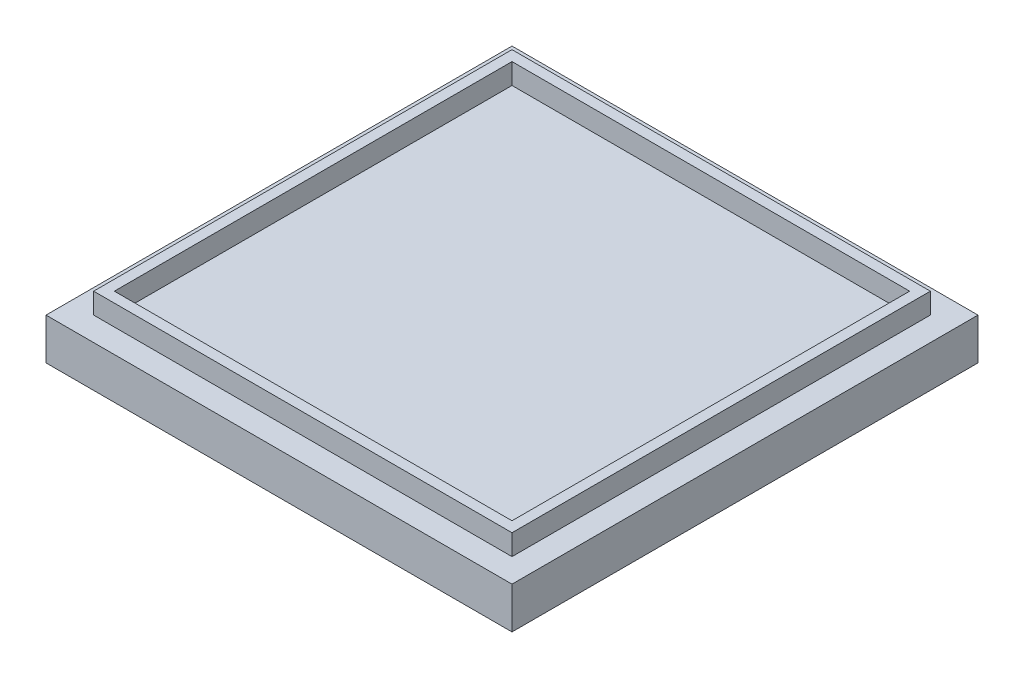
ISO-10303-21;
HEADER;
FILE_DESCRIPTION(('STEP AP214'),'2;1');
FILE_NAME('part.step','',(''),(''),'','','');
FILE_SCHEMA(('AUTOMOTIVE_DESIGN { 1 0 10303 214 1 1 1 1 }'));
ENDSEC;
DATA;
#1=APPLICATION_CONTEXT('core data for automotive mechanical design processes');
#2=APPLICATION_PROTOCOL_DEFINITION('international standard','automotive_design',2000,#1);
#3=PRODUCT_CONTEXT('',#1,'mechanical');
#4=PRODUCT('Part','Part','',(#3));
#5=PRODUCT_RELATED_PRODUCT_CATEGORY('part','',(#4));
#6=PRODUCT_DEFINITION_FORMATION('','',#4);
#7=PRODUCT_DEFINITION_CONTEXT('part definition',#1,'design');
#8=PRODUCT_DEFINITION('design','',#6,#7);
#9=PRODUCT_DEFINITION_SHAPE('','',#8);
#10=(LENGTH_UNIT() NAMED_UNIT(*) SI_UNIT(.MILLI.,.METRE.));
#11=(NAMED_UNIT(*) PLANE_ANGLE_UNIT() SI_UNIT($,.RADIAN.));
#12=(NAMED_UNIT(*) SI_UNIT($,.STERADIAN.) SOLID_ANGLE_UNIT());
#13=UNCERTAINTY_MEASURE_WITH_UNIT(LENGTH_MEASURE(1.E-05),#10,'distance_accuracy_value','');
#14=(GEOMETRIC_REPRESENTATION_CONTEXT(3) GLOBAL_UNCERTAINTY_ASSIGNED_CONTEXT((#13)) GLOBAL_UNIT_ASSIGNED_CONTEXT((#10,
#11,#12)) REPRESENTATION_CONTEXT('',''));
#15=CARTESIAN_POINT('',(0.,0.,0.));
#16=DIRECTION('',(0.,0.,1.));
#17=DIRECTION('',(1.,0.,0.));
#18=AXIS2_PLACEMENT_3D('',#15,#16,#17);
#19=CARTESIAN_POINT('',(0.,20.,0.));
#20=DIRECTION('',(0.,-1.,0.));
#21=DIRECTION('',(0.,0.,-1.));
#22=AXIS2_PLACEMENT_3D('',#19,#20,#21);
#23=PLANE('',#22);
#24=DIRECTION('',(0.,0.,-1.));
#25=VECTOR('',#24,1.);
#26=CARTESIAN_POINT('',(112.5,20.,112.5));
#27=LINE('',#26,#25);
#28=CARTESIAN_POINT('',(112.5,20.,112.5));
#29=VERTEX_POINT('',#28);
#30=CARTESIAN_POINT('',(112.5,20.,-112.5));
#31=VERTEX_POINT('',#30);
#32=EDGE_CURVE('E197',#29,#31,#27,.T.);
#33=ORIENTED_EDGE('',*,*,#32,.T.);
#34=DIRECTION('',(-1.,0.,0.));
#35=VECTOR('',#34,1.);
#36=CARTESIAN_POINT('',(-112.5,20.,-112.5));
#37=LINE('',#36,#35);
#38=CARTESIAN_POINT('',(-112.5,20.,-112.5));
#39=VERTEX_POINT('',#38);
#40=EDGE_CURVE('E200',#31,#39,#37,.T.);
#41=ORIENTED_EDGE('',*,*,#40,.T.);
#42=DIRECTION('',(0.,0.,1.));
#43=VECTOR('',#42,1.);
#44=CARTESIAN_POINT('',(-112.5,20.,112.5));
#45=LINE('',#44,#43);
#46=CARTESIAN_POINT('',(-112.5,20.,112.5));
#47=VERTEX_POINT('',#46);
#48=EDGE_CURVE('E203',#39,#47,#45,.T.);
#49=ORIENTED_EDGE('',*,*,#48,.T.);
#50=DIRECTION('',(1.,0.,0.));
#51=VECTOR('',#50,1.);
#52=CARTESIAN_POINT('',(-112.5,20.,112.5));
#53=LINE('',#52,#51);
#54=EDGE_CURVE('E205',#47,#29,#53,.T.);
#55=ORIENTED_EDGE('',*,*,#54,.T.);
#56=EDGE_LOOP('',(#33,#41,#49,#55));
#57=FACE_BOUND('',#56,.T.);
#58=DIRECTION('',(0.,0.,-1.));
#59=VECTOR('',#58,1.);
#60=CARTESIAN_POINT('',(101.,20.,101.));
#61=LINE('',#60,#59);
#62=CARTESIAN_POINT('',(101.,20.,101.));
#63=VERTEX_POINT('',#62);
#64=CARTESIAN_POINT('',(101.,20.,-101.));
#65=VERTEX_POINT('',#64);
#66=EDGE_CURVE('E145',#63,#65,#61,.T.);
#67=ORIENTED_EDGE('',*,*,#66,.F.);
#68=DIRECTION('',(1.,0.,0.));
#69=VECTOR('',#68,1.);
#70=CARTESIAN_POINT('',(-101.,20.,101.));
#71=LINE('',#70,#69);
#72=CARTESIAN_POINT('',(-101.,20.,101.));
#73=VERTEX_POINT('',#72);
#74=EDGE_CURVE('E173',#73,#63,#71,.T.);
#75=ORIENTED_EDGE('',*,*,#74,.F.);
#76=DIRECTION('',(0.,0.,1.));
#77=VECTOR('',#76,1.);
#78=CARTESIAN_POINT('',(-101.,20.,101.));
#79=LINE('',#78,#77);
#80=CARTESIAN_POINT('',(-101.,20.,-101.));
#81=VERTEX_POINT('',#80);
#82=EDGE_CURVE('E59',#81,#73,#79,.T.);
#83=ORIENTED_EDGE('',*,*,#82,.F.);
#84=DIRECTION('',(-1.,0.,0.));
#85=VECTOR('',#84,1.);
#86=CARTESIAN_POINT('',(-101.,20.,-101.));
#87=LINE('',#86,#85);
#88=EDGE_CURVE('E54',#65,#81,#87,.T.);
#89=ORIENTED_EDGE('',*,*,#88,.F.);
#90=EDGE_LOOP('',(#67,#75,#83,#89));
#91=FACE_BOUND('',#90,.T.);
#92=ADVANCED_FACE('F39',(#57,#91),#23,.F.);
#93=CARTESIAN_POINT('',(112.5,20.,112.5));
#94=DIRECTION('',(-1.,0.,0.));
#95=DIRECTION('',(0.,0.,1.));
#96=AXIS2_PLACEMENT_3D('',#93,#94,#95);
#97=PLANE('',#96);
#98=DIRECTION('',(0.,0.,-1.));
#99=VECTOR('',#98,1.);
#100=CARTESIAN_POINT('',(112.5,0.,112.5));
#101=LINE('',#100,#99);
#102=CARTESIAN_POINT('',(112.5,0.,112.5));
#103=VERTEX_POINT('',#102);
#104=CARTESIAN_POINT('',(112.5,0.,-112.5));
#105=VERTEX_POINT('',#104);
#106=EDGE_CURVE('E196',#103,#105,#101,.T.);
#107=ORIENTED_EDGE('',*,*,#106,.T.);
#108=DIRECTION('',(0.,-1.,0.));
#109=VECTOR('',#108,1.);
#110=CARTESIAN_POINT('',(112.5,20.,-112.5));
#111=LINE('',#110,#109);
#112=EDGE_CURVE('E11',#31,#105,#111,.T.);
#113=ORIENTED_EDGE('',*,*,#112,.F.);
#114=ORIENTED_EDGE('',*,*,#32,.F.);
#115=DIRECTION('',(0.,-1.,0.));
#116=VECTOR('',#115,1.);
#117=CARTESIAN_POINT('',(112.5,20.,112.5));
#118=LINE('',#117,#116);
#119=EDGE_CURVE('E207',#29,#103,#118,.T.);
#120=ORIENTED_EDGE('',*,*,#119,.T.);
#121=EDGE_LOOP('',(#107,#113,#114,#120));
#122=FACE_BOUND('',#121,.T.);
#123=ADVANCED_FACE('F41',(#122),#97,.F.);
#124=CARTESIAN_POINT('',(-112.5,20.,-112.5));
#125=DIRECTION('',(0.,0.,1.));
#126=DIRECTION('',(1.,0.,0.));
#127=AXIS2_PLACEMENT_3D('',#124,#125,#126);
#128=PLANE('',#127);
#129=DIRECTION('',(-1.,0.,0.));
#130=VECTOR('',#129,1.);
#131=CARTESIAN_POINT('',(-112.5,0.,-112.5));
#132=LINE('',#131,#130);
#133=CARTESIAN_POINT('',(-112.5,0.,-112.5));
#134=VERTEX_POINT('',#133);
#135=EDGE_CURVE('E210',#105,#134,#132,.T.);
#136=ORIENTED_EDGE('',*,*,#135,.T.);
#137=DIRECTION('',(0.,-1.,0.));
#138=VECTOR('',#137,1.);
#139=CARTESIAN_POINT('',(-112.5,20.,-112.5));
#140=LINE('',#139,#138);
#141=EDGE_CURVE('E47',#39,#134,#140,.T.);
#142=ORIENTED_EDGE('',*,*,#141,.F.);
#143=ORIENTED_EDGE('',*,*,#40,.F.);
#144=ORIENTED_EDGE('',*,*,#112,.T.);
#145=EDGE_LOOP('',(#136,#142,#143,#144));
#146=FACE_BOUND('',#145,.T.);
#147=ADVANCED_FACE('F239',(#146),#128,.F.);
#148=CARTESIAN_POINT('',(-112.5,20.,112.5));
#149=DIRECTION('',(1.,0.,0.));
#150=DIRECTION('',(0.,0.,-1.));
#151=AXIS2_PLACEMENT_3D('',#148,#149,#150);
#152=PLANE('',#151);
#153=DIRECTION('',(0.,0.,1.));
#154=VECTOR('',#153,1.);
#155=CARTESIAN_POINT('',(-112.5,0.,112.5));
#156=LINE('',#155,#154);
#157=CARTESIAN_POINT('',(-112.5,0.,112.5));
#158=VERTEX_POINT('',#157);
#159=EDGE_CURVE('E212',#134,#158,#156,.T.);
#160=ORIENTED_EDGE('',*,*,#159,.T.);
#161=DIRECTION('',(0.,-1.,0.));
#162=VECTOR('',#161,1.);
#163=CARTESIAN_POINT('',(-112.5,20.,112.5));
#164=LINE('',#163,#162);
#165=EDGE_CURVE('E217',#47,#158,#164,.T.);
#166=ORIENTED_EDGE('',*,*,#165,.F.);
#167=ORIENTED_EDGE('',*,*,#48,.F.);
#168=ORIENTED_EDGE('',*,*,#141,.T.);
#169=EDGE_LOOP('',(#160,#166,#167,#168));
#170=FACE_BOUND('',#169,.T.);
#171=ADVANCED_FACE('F224',(#170),#152,.F.);
#172=CARTESIAN_POINT('',(-112.5,20.,112.5));
#173=DIRECTION('',(0.,0.,-1.));
#174=DIRECTION('',(-1.,0.,0.));
#175=AXIS2_PLACEMENT_3D('',#172,#173,#174);
#176=PLANE('',#175);
#177=DIRECTION('',(1.,0.,0.));
#178=VECTOR('',#177,1.);
#179=CARTESIAN_POINT('',(-112.5,0.,112.5));
#180=LINE('',#179,#178);
#181=EDGE_CURVE('E201',#158,#103,#180,.T.);
#182=ORIENTED_EDGE('',*,*,#181,.T.);
#183=ORIENTED_EDGE('',*,*,#119,.F.);
#184=ORIENTED_EDGE('',*,*,#54,.F.);
#185=ORIENTED_EDGE('',*,*,#165,.T.);
#186=EDGE_LOOP('',(#182,#183,#184,#185));
#187=FACE_BOUND('',#186,.T.);
#188=ADVANCED_FACE('F233',(#187),#176,.F.);
#189=CARTESIAN_POINT('',(0.,0.,0.));
#190=DIRECTION('',(0.,-1.,0.));
#191=DIRECTION('',(0.,0.,-1.));
#192=AXIS2_PLACEMENT_3D('',#189,#190,#191);
#193=PLANE('',#192);
#194=ORIENTED_EDGE('',*,*,#106,.F.);
#195=ORIENTED_EDGE('',*,*,#181,.F.);
#196=ORIENTED_EDGE('',*,*,#159,.F.);
#197=ORIENTED_EDGE('',*,*,#135,.F.);
#198=EDGE_LOOP('',(#194,#195,#196,#197));
#199=FACE_BOUND('',#198,.T.);
#200=ADVANCED_FACE('F230',(#199),#193,.T.);
#201=CARTESIAN_POINT('',(0.,30.,0.));
#202=DIRECTION('',(0.,-1.,0.));
#203=DIRECTION('',(0.,0.,-1.));
#204=AXIS2_PLACEMENT_3D('',#201,#202,#203);
#205=PLANE('',#204);
#206=DIRECTION('',(0.,0.,-1.));
#207=VECTOR('',#206,1.);
#208=CARTESIAN_POINT('',(101.,30.,101.));
#209=LINE('',#208,#207);
#210=CARTESIAN_POINT('',(101.,30.,101.));
#211=VERTEX_POINT('',#210);
#212=CARTESIAN_POINT('',(101.,30.,-101.));
#213=VERTEX_POINT('',#212);
#214=EDGE_CURVE('E169',#211,#213,#209,.T.);
#215=ORIENTED_EDGE('',*,*,#214,.T.);
#216=DIRECTION('',(-1.,0.,0.));
#217=VECTOR('',#216,1.);
#218=CARTESIAN_POINT('',(-101.,30.,-101.));
#219=LINE('',#218,#217);
#220=CARTESIAN_POINT('',(-101.,30.,-101.));
#221=VERTEX_POINT('',#220);
#222=EDGE_CURVE('E172',#213,#221,#219,.T.);
#223=ORIENTED_EDGE('',*,*,#222,.T.);
#224=DIRECTION('',(0.,0.,1.));
#225=VECTOR('',#224,1.);
#226=CARTESIAN_POINT('',(-101.,30.,101.));
#227=LINE('',#226,#225);
#228=CARTESIAN_POINT('',(-101.,30.,101.));
#229=VERTEX_POINT('',#228);
#230=EDGE_CURVE('E175',#221,#229,#227,.T.);
#231=ORIENTED_EDGE('',*,*,#230,.T.);
#232=DIRECTION('',(1.,0.,0.));
#233=VECTOR('',#232,1.);
#234=CARTESIAN_POINT('',(-101.,30.,101.));
#235=LINE('',#234,#233);
#236=EDGE_CURVE('E177',#229,#211,#235,.T.);
#237=ORIENTED_EDGE('',*,*,#236,.T.);
#238=EDGE_LOOP('',(#215,#223,#231,#237));
#239=FACE_BOUND('',#238,.T.);
#240=DIRECTION('',(0.,0.,1.));
#241=VECTOR('',#240,1.);
#242=CARTESIAN_POINT('',(-96.,30.,96.0000000000002));
#243=LINE('',#242,#241);
#244=CARTESIAN_POINT('',(-96.,30.,-96.0000000000002));
#245=VERTEX_POINT('',#244);
#246=CARTESIAN_POINT('',(-96.,30.,96.0000000000002));
#247=VERTEX_POINT('',#246);
#248=EDGE_CURVE('E127',#245,#247,#243,.T.);
#249=ORIENTED_EDGE('',*,*,#248,.F.);
#250=DIRECTION('',(-1.,0.,0.));
#251=VECTOR('',#250,1.);
#252=CARTESIAN_POINT('',(96.,30.,-96.0000000000002));
#253=LINE('',#252,#251);
#254=CARTESIAN_POINT('',(96.,30.,-96.0000000000002));
#255=VERTEX_POINT('',#254);
#256=EDGE_CURVE('E153',#255,#245,#253,.T.);
#257=ORIENTED_EDGE('',*,*,#256,.F.);
#258=DIRECTION('',(0.,0.,-1.));
#259=VECTOR('',#258,1.);
#260=CARTESIAN_POINT('',(96.,30.,96.0000000000002));
#261=LINE('',#260,#259);
#262=CARTESIAN_POINT('',(96.,30.,96.0000000000002));
#263=VERTEX_POINT('',#262);
#264=EDGE_CURVE('E151',#263,#255,#261,.T.);
#265=ORIENTED_EDGE('',*,*,#264,.F.);
#266=DIRECTION('',(1.,0.,0.));
#267=VECTOR('',#266,1.);
#268=CARTESIAN_POINT('',(96.,30.,96.0000000000002));
#269=LINE('',#268,#267);
#270=EDGE_CURVE('E137',#247,#263,#269,.T.);
#271=ORIENTED_EDGE('',*,*,#270,.F.);
#272=EDGE_LOOP('',(#249,#257,#265,#271));
#273=FACE_BOUND('',#272,.T.);
#274=ADVANCED_FACE('F149',(#239,#273),#205,.F.);
#275=CARTESIAN_POINT('',(101.,30.,101.));
#276=DIRECTION('',(-1.,0.,0.));
#277=DIRECTION('',(0.,0.,1.));
#278=AXIS2_PLACEMENT_3D('',#275,#276,#277);
#279=PLANE('',#278);
#280=ORIENTED_EDGE('',*,*,#66,.T.);
#281=DIRECTION('',(0.,-1.,0.));
#282=VECTOR('',#281,1.);
#283=CARTESIAN_POINT('',(101.,30.,-101.));
#284=LINE('',#283,#282);
#285=EDGE_CURVE('E194',#213,#65,#284,.T.);
#286=ORIENTED_EDGE('',*,*,#285,.F.);
#287=ORIENTED_EDGE('',*,*,#214,.F.);
#288=DIRECTION('',(0.,-1.,0.));
#289=VECTOR('',#288,1.);
#290=CARTESIAN_POINT('',(101.,30.,101.));
#291=LINE('',#290,#289);
#292=EDGE_CURVE('E179',#211,#63,#291,.T.);
#293=ORIENTED_EDGE('',*,*,#292,.T.);
#294=EDGE_LOOP('',(#280,#286,#287,#293));
#295=FACE_BOUND('',#294,.T.);
#296=ADVANCED_FACE('F277',(#295),#279,.F.);
#297=CARTESIAN_POINT('',(-101.,30.,-101.));
#298=DIRECTION('',(0.,0.,1.));
#299=DIRECTION('',(1.,0.,0.));
#300=AXIS2_PLACEMENT_3D('',#297,#298,#299);
#301=PLANE('',#300);
#302=ORIENTED_EDGE('',*,*,#88,.T.);
#303=DIRECTION('',(0.,-1.,0.));
#304=VECTOR('',#303,1.);
#305=CARTESIAN_POINT('',(-101.,30.,-101.));
#306=LINE('',#305,#304);
#307=EDGE_CURVE('E191',#221,#81,#306,.T.);
#308=ORIENTED_EDGE('',*,*,#307,.F.);
#309=ORIENTED_EDGE('',*,*,#222,.F.);
#310=ORIENTED_EDGE('',*,*,#285,.T.);
#311=EDGE_LOOP('',(#302,#308,#309,#310));
#312=FACE_BOUND('',#311,.T.);
#313=ADVANCED_FACE('F285',(#312),#301,.F.);
#314=CARTESIAN_POINT('',(-101.,30.,101.));
#315=DIRECTION('',(1.,0.,0.));
#316=DIRECTION('',(0.,0.,-1.));
#317=AXIS2_PLACEMENT_3D('',#314,#315,#316);
#318=PLANE('',#317);
#319=ORIENTED_EDGE('',*,*,#82,.T.);
#320=DIRECTION('',(0.,-1.,0.));
#321=VECTOR('',#320,1.);
#322=CARTESIAN_POINT('',(-101.,30.,101.));
#323=LINE('',#322,#321);
#324=EDGE_CURVE('E188',#229,#73,#323,.T.);
#325=ORIENTED_EDGE('',*,*,#324,.F.);
#326=ORIENTED_EDGE('',*,*,#230,.F.);
#327=ORIENTED_EDGE('',*,*,#307,.T.);
#328=EDGE_LOOP('',(#319,#325,#326,#327));
#329=FACE_BOUND('',#328,.T.);
#330=ADVANCED_FACE('F281',(#329),#318,.F.);
#331=CARTESIAN_POINT('',(-101.,30.,101.));
#332=DIRECTION('',(0.,0.,-1.));
#333=DIRECTION('',(-1.,0.,0.));
#334=AXIS2_PLACEMENT_3D('',#331,#332,#333);
#335=PLANE('',#334);
#336=ORIENTED_EDGE('',*,*,#74,.T.);
#337=ORIENTED_EDGE('',*,*,#292,.F.);
#338=ORIENTED_EDGE('',*,*,#236,.F.);
#339=ORIENTED_EDGE('',*,*,#324,.T.);
#340=EDGE_LOOP('',(#336,#337,#338,#339));
#341=FACE_BOUND('',#340,.T.);
#342=ADVANCED_FACE('F274',(#341),#335,.F.);
#343=CARTESIAN_POINT('',(-96.,30.,96.0000000000002));
#344=DIRECTION('',(1.,0.,0.));
#345=DIRECTION('',(0.,0.,-1.));
#346=AXIS2_PLACEMENT_3D('',#343,#344,#345);
#347=PLANE('',#346);
#348=DIRECTION('',(0.,0.,1.));
#349=VECTOR('',#348,1.);
#350=CARTESIAN_POINT('',(-96.,20.,96.0000000000002));
#351=LINE('',#350,#349);
#352=CARTESIAN_POINT('',(-96.,20.,-96.0000000000002));
#353=VERTEX_POINT('',#352);
#354=CARTESIAN_POINT('',(-96.,20.,96.0000000000002));
#355=VERTEX_POINT('',#354);
#356=EDGE_CURVE('E157',#353,#355,#351,.T.);
#357=ORIENTED_EDGE('',*,*,#356,.F.);
#358=DIRECTION('',(0.,-1.,0.));
#359=VECTOR('',#358,1.);
#360=CARTESIAN_POINT('',(-96.,30.,-96.0000000000002));
#361=LINE('',#360,#359);
#362=EDGE_CURVE('E133',#245,#353,#361,.T.);
#363=ORIENTED_EDGE('',*,*,#362,.F.);
#364=ORIENTED_EDGE('',*,*,#248,.T.);
#365=DIRECTION('',(0.,-1.,0.));
#366=VECTOR('',#365,1.);
#367=CARTESIAN_POINT('',(-96.,30.,96.0000000000002));
#368=LINE('',#367,#366);
#369=EDGE_CURVE('E131',#247,#355,#368,.T.);
#370=ORIENTED_EDGE('',*,*,#369,.T.);
#371=EDGE_LOOP('',(#357,#363,#364,#370));
#372=FACE_BOUND('',#371,.T.);
#373=ADVANCED_FACE('F130',(#372),#347,.T.);
#374=CARTESIAN_POINT('',(96.,30.,96.0000000000002));
#375=DIRECTION('',(0.,0.,-1.));
#376=DIRECTION('',(-1.,0.,0.));
#377=AXIS2_PLACEMENT_3D('',#374,#375,#376);
#378=PLANE('',#377);
#379=DIRECTION('',(1.,0.,0.));
#380=VECTOR('',#379,1.);
#381=CARTESIAN_POINT('',(96.,20.,96.0000000000002));
#382=LINE('',#381,#380);
#383=CARTESIAN_POINT('',(96.,20.,96.0000000000002));
#384=VERTEX_POINT('',#383);
#385=EDGE_CURVE('E144',#355,#384,#382,.T.);
#386=ORIENTED_EDGE('',*,*,#385,.F.);
#387=ORIENTED_EDGE('',*,*,#369,.F.);
#388=ORIENTED_EDGE('',*,*,#270,.T.);
#389=DIRECTION('',(0.,-1.,0.));
#390=VECTOR('',#389,1.);
#391=CARTESIAN_POINT('',(96.,30.,96.0000000000002));
#392=LINE('',#391,#390);
#393=EDGE_CURVE('E146',#263,#384,#392,.T.);
#394=ORIENTED_EDGE('',*,*,#393,.T.);
#395=EDGE_LOOP('',(#386,#387,#388,#394));
#396=FACE_BOUND('',#395,.T.);
#397=ADVANCED_FACE('F141',(#396),#378,.T.);
#398=CARTESIAN_POINT('',(96.,30.,96.0000000000002));
#399=DIRECTION('',(-1.,0.,0.));
#400=DIRECTION('',(0.,0.,1.));
#401=AXIS2_PLACEMENT_3D('',#398,#399,#400);
#402=PLANE('',#401);
#403=DIRECTION('',(0.,0.,-1.));
#404=VECTOR('',#403,1.);
#405=CARTESIAN_POINT('',(96.,20.,96.0000000000002));
#406=LINE('',#405,#404);
#407=CARTESIAN_POINT('',(96.,20.,-96.0000000000002));
#408=VERTEX_POINT('',#407);
#409=EDGE_CURVE('E160',#384,#408,#406,.T.);
#410=ORIENTED_EDGE('',*,*,#409,.F.);
#411=ORIENTED_EDGE('',*,*,#393,.F.);
#412=ORIENTED_EDGE('',*,*,#264,.T.);
#413=DIRECTION('',(0.,-1.,0.));
#414=VECTOR('',#413,1.);
#415=CARTESIAN_POINT('',(96.,30.,-96.0000000000002));
#416=LINE('',#415,#414);
#417=EDGE_CURVE('E166',#255,#408,#416,.T.);
#418=ORIENTED_EDGE('',*,*,#417,.T.);
#419=EDGE_LOOP('',(#410,#411,#412,#418));
#420=FACE_BOUND('',#419,.T.);
#421=ADVANCED_FACE('F259',(#420),#402,.T.);
#422=CARTESIAN_POINT('',(96.,30.,-96.0000000000002));
#423=DIRECTION('',(0.,0.,1.));
#424=DIRECTION('',(1.,0.,0.));
#425=AXIS2_PLACEMENT_3D('',#422,#423,#424);
#426=PLANE('',#425);
#427=DIRECTION('',(-1.,0.,0.));
#428=VECTOR('',#427,1.);
#429=CARTESIAN_POINT('',(96.,20.,-96.0000000000002));
#430=LINE('',#429,#428);
#431=EDGE_CURVE('E138',#408,#353,#430,.T.);
#432=ORIENTED_EDGE('',*,*,#431,.F.);
#433=ORIENTED_EDGE('',*,*,#417,.F.);
#434=ORIENTED_EDGE('',*,*,#256,.T.);
#435=ORIENTED_EDGE('',*,*,#362,.T.);
#436=EDGE_LOOP('',(#432,#433,#434,#435));
#437=FACE_BOUND('',#436,.T.);
#438=ADVANCED_FACE('F254',(#437),#426,.T.);
#439=ORIENTED_EDGE('',*,*,#431,.T.);
#440=ORIENTED_EDGE('',*,*,#356,.T.);
#441=ORIENTED_EDGE('',*,*,#385,.T.);
#442=ORIENTED_EDGE('',*,*,#409,.T.);
#443=EDGE_LOOP('',(#439,#440,#441,#442));
#444=FACE_BOUND('',#443,.T.);
#445=ADVANCED_FACE('F248',(#444),#23,.F.);
#446=CLOSED_SHELL('',(#92,#123,#147,#171,#188,#200,#274,#296,#313,#330,#342,#373,#397,#421,#438,#445));
#447=MANIFOLD_SOLID_BREP('B2',#446);
#448=ADVANCED_BREP_SHAPE_REPRESENTATION('',(#18,#447),#14);
#449=SHAPE_DEFINITION_REPRESENTATION(#9,#448);
ENDSEC;
END-ISO-10303-21;
